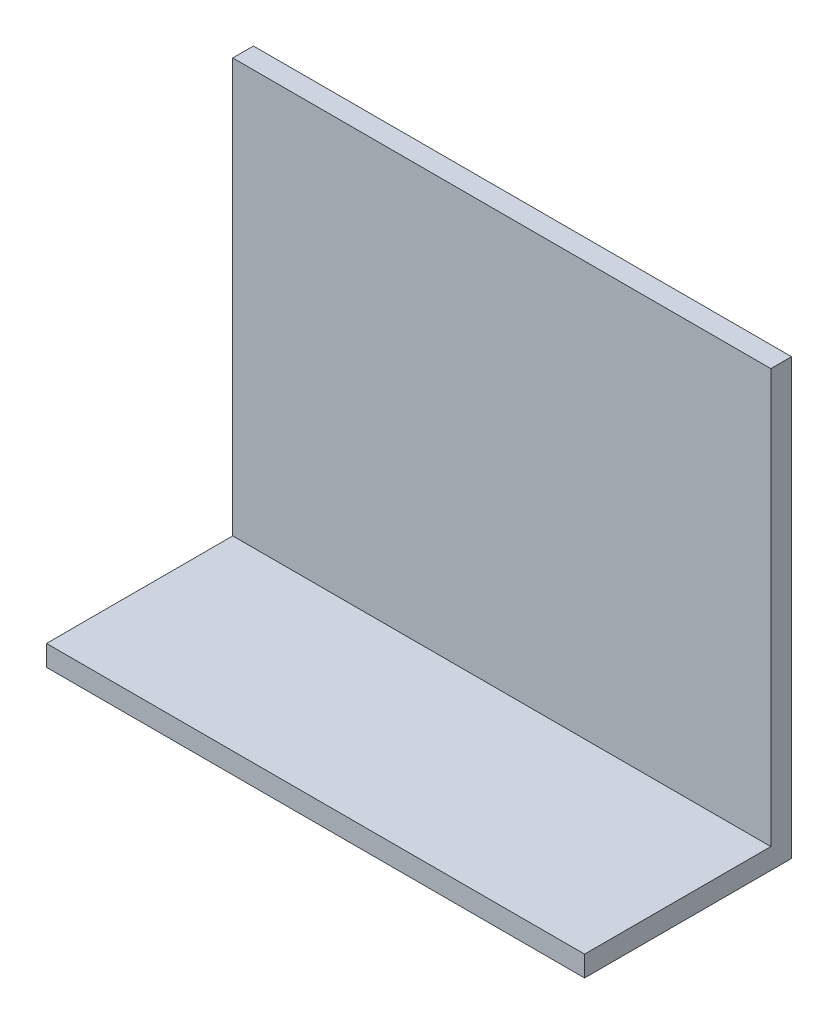
ISO-10303-21;
HEADER;
FILE_DESCRIPTION(('STEP AP214'),'2;1');
FILE_NAME('part.step','',(''),(''),'','','');
FILE_SCHEMA(('AUTOMOTIVE_DESIGN { 1 0 10303 214 1 1 1 1 }'));
ENDSEC;
DATA;
#1=APPLICATION_CONTEXT('core data for automotive mechanical design processes');
#2=APPLICATION_PROTOCOL_DEFINITION('international standard','automotive_design',2000,#1);
#3=PRODUCT_CONTEXT('',#1,'mechanical');
#4=PRODUCT('Part','Part','',(#3));
#5=PRODUCT_RELATED_PRODUCT_CATEGORY('part','',(#4));
#6=PRODUCT_DEFINITION_FORMATION('','',#4);
#7=PRODUCT_DEFINITION_CONTEXT('part definition',#1,'design');
#8=PRODUCT_DEFINITION('design','',#6,#7);
#9=PRODUCT_DEFINITION_SHAPE('','',#8);
#10=(LENGTH_UNIT() NAMED_UNIT(*) SI_UNIT(.MILLI.,.METRE.));
#11=(NAMED_UNIT(*) PLANE_ANGLE_UNIT() SI_UNIT($,.RADIAN.));
#12=(NAMED_UNIT(*) SI_UNIT($,.STERADIAN.) SOLID_ANGLE_UNIT());
#13=UNCERTAINTY_MEASURE_WITH_UNIT(LENGTH_MEASURE(1.E-05),#10,'distance_accuracy_value','');
#14=(GEOMETRIC_REPRESENTATION_CONTEXT(3) GLOBAL_UNCERTAINTY_ASSIGNED_CONTEXT((#13)) GLOBAL_UNIT_ASSIGNED_CONTEXT((#10,
#11,#12)) REPRESENTATION_CONTEXT('',''));
#15=CARTESIAN_POINT('',(0.,0.,0.));
#16=DIRECTION('',(0.,0.,1.));
#17=DIRECTION('',(1.,0.,0.));
#18=AXIS2_PLACEMENT_3D('',#15,#16,#17);
#19=CARTESIAN_POINT('',(0.,0.,20.));
#20=DIRECTION('',(0.,0.,-1.));
#21=DIRECTION('',(-1.,0.,0.));
#22=AXIS2_PLACEMENT_3D('',#19,#20,#21);
#23=PLANE('',#22);
#24=DIRECTION('',(1.,0.,0.));
#25=VECTOR('',#24,1.);
#26=CARTESIAN_POINT('',(0.,-19.,20.));
#27=LINE('',#26,#25);
#28=CARTESIAN_POINT('',(-26.,-19.,20.));
#29=VERTEX_POINT('',#28);
#30=CARTESIAN_POINT('',(26.,-19.,20.));
#31=VERTEX_POINT('',#30);
#32=EDGE_CURVE('E41',#29,#31,#27,.T.);
#33=ORIENTED_EDGE('',*,*,#32,.F.);
#34=DIRECTION('',(0.,-1.,0.));
#35=VECTOR('',#34,1.);
#36=CARTESIAN_POINT('',(-26.,-21.,20.));
#37=LINE('',#36,#35);
#38=CARTESIAN_POINT('',(-26.,-21.,20.));
#39=VERTEX_POINT('',#38);
#40=EDGE_CURVE('E121',#29,#39,#37,.T.);
#41=ORIENTED_EDGE('',*,*,#40,.T.);
#42=DIRECTION('',(1.,0.,0.));
#43=VECTOR('',#42,1.);
#44=CARTESIAN_POINT('',(-26.,-21.,20.));
#45=LINE('',#44,#43);
#46=CARTESIAN_POINT('',(26.,-21.,20.));
#47=VERTEX_POINT('',#46);
#48=EDGE_CURVE('E57',#39,#47,#45,.T.);
#49=ORIENTED_EDGE('',*,*,#48,.T.);
#50=DIRECTION('',(0.,1.,0.));
#51=VECTOR('',#50,1.);
#52=CARTESIAN_POINT('',(26.,-21.,20.));
#53=LINE('',#52,#51);
#54=EDGE_CURVE('E86',#47,#31,#53,.T.);
#55=ORIENTED_EDGE('',*,*,#54,.T.);
#56=EDGE_LOOP('',(#33,#41,#49,#55));
#57=FACE_BOUND('',#56,.T.);
#58=ADVANCED_FACE('F33',(#57),#23,.F.);
#59=CARTESIAN_POINT('',(26.,-21.,20.));
#60=DIRECTION('',(-1.,0.,0.));
#61=DIRECTION('',(0.,0.,1.));
#62=AXIS2_PLACEMENT_3D('',#59,#60,#61);
#63=PLANE('',#62);
#64=DIRECTION('',(0.,0.,-1.));
#65=VECTOR('',#64,1.);
#66=CARTESIAN_POINT('',(26.,21.,20.));
#67=LINE('',#66,#65);
#68=CARTESIAN_POINT('',(26.,21.,2.));
#69=VERTEX_POINT('',#68);
#70=CARTESIAN_POINT('',(26.,21.,0.));
#71=VERTEX_POINT('',#70);
#72=EDGE_CURVE('E112',#69,#71,#67,.T.);
#73=ORIENTED_EDGE('',*,*,#72,.F.);
#74=DIRECTION('',(0.,-1.,0.));
#75=VECTOR('',#74,1.);
#76=CARTESIAN_POINT('',(26.,-21.,2.));
#77=LINE('',#76,#75);
#78=CARTESIAN_POINT('',(26.,-19.,2.));
#79=VERTEX_POINT('',#78);
#80=EDGE_CURVE('E99',#69,#79,#77,.T.);
#81=ORIENTED_EDGE('',*,*,#80,.T.);
#82=DIRECTION('',(0.,0.,-1.));
#83=VECTOR('',#82,1.);
#84=CARTESIAN_POINT('',(26.,-19.,20.));
#85=LINE('',#84,#83);
#86=EDGE_CURVE('E103',#31,#79,#85,.T.);
#87=ORIENTED_EDGE('',*,*,#86,.F.);
#88=ORIENTED_EDGE('',*,*,#54,.F.);
#89=DIRECTION('',(0.,0.,-1.));
#90=VECTOR('',#89,1.);
#91=CARTESIAN_POINT('',(26.,-21.,20.));
#92=LINE('',#91,#90);
#93=CARTESIAN_POINT('',(26.,-21.,0.));
#94=VERTEX_POINT('',#93);
#95=EDGE_CURVE('E79',#47,#94,#92,.T.);
#96=ORIENTED_EDGE('',*,*,#95,.T.);
#97=DIRECTION('',(0.,1.,0.));
#98=VECTOR('',#97,1.);
#99=CARTESIAN_POINT('',(26.,-21.,0.));
#100=LINE('',#99,#98);
#101=EDGE_CURVE('E92',#94,#71,#100,.T.);
#102=ORIENTED_EDGE('',*,*,#101,.T.);
#103=EDGE_LOOP('',(#73,#81,#87,#88,#96,#102));
#104=FACE_BOUND('',#103,.T.);
#105=ADVANCED_FACE('F35',(#104),#63,.F.);
#106=CARTESIAN_POINT('',(-26.,21.,20.));
#107=DIRECTION('',(0.,-1.,0.));
#108=DIRECTION('',(0.,0.,-1.));
#109=AXIS2_PLACEMENT_3D('',#106,#107,#108);
#110=PLANE('',#109);
#111=DIRECTION('',(0.,0.,-1.));
#112=VECTOR('',#111,1.);
#113=CARTESIAN_POINT('',(-26.,21.,20.));
#114=LINE('',#113,#112);
#115=CARTESIAN_POINT('',(-26.,21.,2.));
#116=VERTEX_POINT('',#115);
#117=CARTESIAN_POINT('',(-26.,21.,0.));
#118=VERTEX_POINT('',#117);
#119=EDGE_CURVE('E110',#116,#118,#114,.T.);
#120=ORIENTED_EDGE('',*,*,#119,.F.);
#121=DIRECTION('',(-1.,0.,0.));
#122=VECTOR('',#121,1.);
#123=CARTESIAN_POINT('',(34.4102153998165,21.,2.));
#124=LINE('',#123,#122);
#125=EDGE_CURVE('E126',#69,#116,#124,.T.);
#126=ORIENTED_EDGE('',*,*,#125,.F.);
#127=ORIENTED_EDGE('',*,*,#72,.T.);
#128=DIRECTION('',(-1.,0.,0.));
#129=VECTOR('',#128,1.);
#130=CARTESIAN_POINT('',(-26.,21.,0.));
#131=LINE('',#130,#129);
#132=EDGE_CURVE('E98',#71,#118,#131,.T.);
#133=ORIENTED_EDGE('',*,*,#132,.T.);
#134=EDGE_LOOP('',(#120,#126,#127,#133));
#135=FACE_BOUND('',#134,.T.);
#136=ADVANCED_FACE('F138',(#135),#110,.F.);
#137=CARTESIAN_POINT('',(-26.,-21.,20.));
#138=DIRECTION('',(1.,0.,0.));
#139=DIRECTION('',(0.,0.,-1.));
#140=AXIS2_PLACEMENT_3D('',#137,#138,#139);
#141=PLANE('',#140);
#142=DIRECTION('',(0.,0.,1.));
#143=VECTOR('',#142,1.);
#144=CARTESIAN_POINT('',(-26.,-19.,20.));
#145=LINE('',#144,#143);
#146=CARTESIAN_POINT('',(-26.,-19.,2.));
#147=VERTEX_POINT('',#146);
#148=EDGE_CURVE('E48',#147,#29,#145,.T.);
#149=ORIENTED_EDGE('',*,*,#148,.F.);
#150=DIRECTION('',(0.,1.,0.));
#151=VECTOR('',#150,1.);
#152=CARTESIAN_POINT('',(-26.,-21.,2.));
#153=LINE('',#152,#151);
#154=EDGE_CURVE('E11',#147,#116,#153,.T.);
#155=ORIENTED_EDGE('',*,*,#154,.T.);
#156=ORIENTED_EDGE('',*,*,#119,.T.);
#157=DIRECTION('',(0.,-1.,0.));
#158=VECTOR('',#157,1.);
#159=CARTESIAN_POINT('',(-26.,-21.,0.));
#160=LINE('',#159,#158);
#161=CARTESIAN_POINT('',(-26.,-21.,0.));
#162=VERTEX_POINT('',#161);
#163=EDGE_CURVE('E87',#118,#162,#160,.T.);
#164=ORIENTED_EDGE('',*,*,#163,.T.);
#165=DIRECTION('',(0.,0.,-1.));
#166=VECTOR('',#165,1.);
#167=CARTESIAN_POINT('',(-26.,-21.,20.));
#168=LINE('',#167,#166);
#169=EDGE_CURVE('E82',#39,#162,#168,.T.);
#170=ORIENTED_EDGE('',*,*,#169,.F.);
#171=ORIENTED_EDGE('',*,*,#40,.F.);
#172=EDGE_LOOP('',(#149,#155,#156,#164,#170,#171));
#173=FACE_BOUND('',#172,.T.);
#174=ADVANCED_FACE('F133',(#173),#141,.F.);
#175=CARTESIAN_POINT('',(-26.,-21.,20.));
#176=DIRECTION('',(0.,1.,0.));
#177=DIRECTION('',(0.,0.,1.));
#178=AXIS2_PLACEMENT_3D('',#175,#176,#177);
#179=PLANE('',#178);
#180=DIRECTION('',(1.,0.,0.));
#181=VECTOR('',#180,1.);
#182=CARTESIAN_POINT('',(-26.,-21.,0.));
#183=LINE('',#182,#181);
#184=EDGE_CURVE('E76',#162,#94,#183,.T.);
#185=ORIENTED_EDGE('',*,*,#184,.T.);
#186=ORIENTED_EDGE('',*,*,#95,.F.);
#187=ORIENTED_EDGE('',*,*,#48,.F.);
#188=ORIENTED_EDGE('',*,*,#169,.T.);
#189=EDGE_LOOP('',(#185,#186,#187,#188));
#190=FACE_BOUND('',#189,.T.);
#191=ADVANCED_FACE('F78',(#190),#179,.F.);
#192=CARTESIAN_POINT('',(0.,0.,0.));
#193=DIRECTION('',(0.,0.,-1.));
#194=DIRECTION('',(-1.,0.,0.));
#195=AXIS2_PLACEMENT_3D('',#192,#193,#194);
#196=PLANE('',#195);
#197=ORIENTED_EDGE('',*,*,#101,.F.);
#198=ORIENTED_EDGE('',*,*,#184,.F.);
#199=ORIENTED_EDGE('',*,*,#163,.F.);
#200=ORIENTED_EDGE('',*,*,#132,.F.);
#201=EDGE_LOOP('',(#197,#198,#199,#200));
#202=FACE_BOUND('',#201,.T.);
#203=ADVANCED_FACE('F96',(#202),#196,.T.);
#204=CARTESIAN_POINT('',(34.4102153998165,-19.,2.));
#205=DIRECTION('',(0.,0.,-1.));
#206=DIRECTION('',(-1.,0.,0.));
#207=AXIS2_PLACEMENT_3D('',#204,#205,#206);
#208=PLANE('',#207);
#209=ORIENTED_EDGE('',*,*,#125,.T.);
#210=ORIENTED_EDGE('',*,*,#154,.F.);
#211=DIRECTION('',(-1.,0.,0.));
#212=VECTOR('',#211,1.);
#213=CARTESIAN_POINT('',(34.4102153998165,-19.,2.));
#214=LINE('',#213,#212);
#215=EDGE_CURVE('E125',#79,#147,#214,.T.);
#216=ORIENTED_EDGE('',*,*,#215,.F.);
#217=ORIENTED_EDGE('',*,*,#80,.F.);
#218=EDGE_LOOP('',(#209,#210,#216,#217));
#219=FACE_BOUND('',#218,.T.);
#220=ADVANCED_FACE('F143',(#219),#208,.F.);
#221=CARTESIAN_POINT('',(0.,-19.,0.));
#222=DIRECTION('',(0.,1.,0.));
#223=DIRECTION('',(0.,0.,1.));
#224=AXIS2_PLACEMENT_3D('',#221,#222,#223);
#225=PLANE('',#224);
#226=ORIENTED_EDGE('',*,*,#86,.T.);
#227=ORIENTED_EDGE('',*,*,#215,.T.);
#228=ORIENTED_EDGE('',*,*,#148,.T.);
#229=ORIENTED_EDGE('',*,*,#32,.T.);
#230=EDGE_LOOP('',(#226,#227,#228,#229));
#231=FACE_BOUND('',#230,.T.);
#232=ADVANCED_FACE('F114',(#231),#225,.T.);
#233=CLOSED_SHELL('',(#58,#105,#136,#174,#191,#203,#220,#232));
#234=MANIFOLD_SOLID_BREP('B2',#233);
#235=ADVANCED_BREP_SHAPE_REPRESENTATION('',(#18,#234),#14);
#236=SHAPE_DEFINITION_REPRESENTATION(#9,#235);
ENDSEC;
END-ISO-10303-21;
